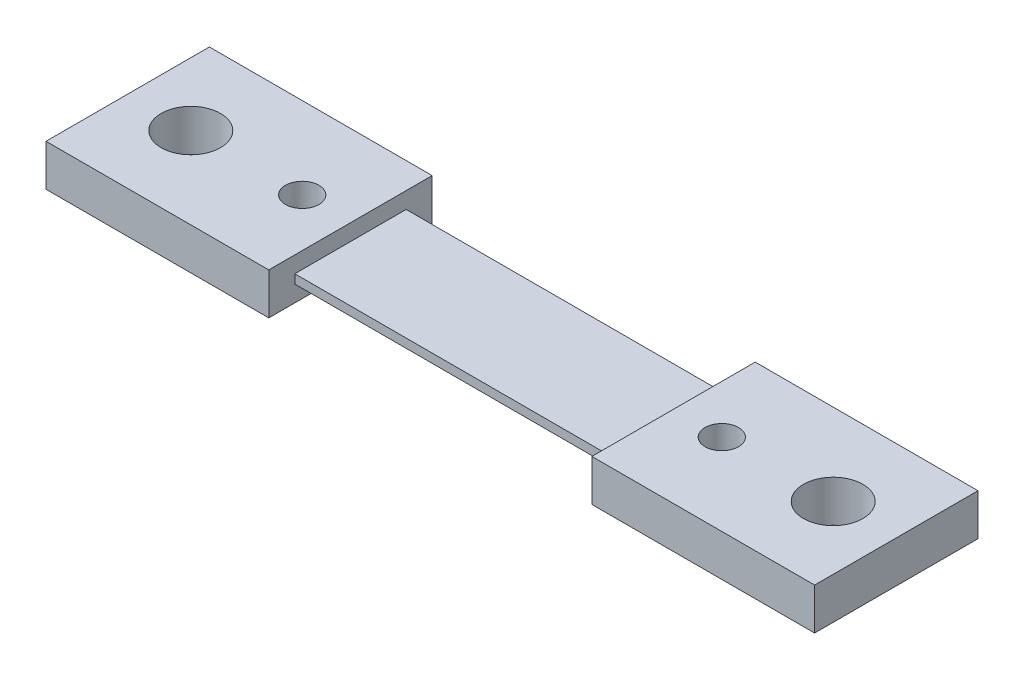
ISO-10303-21;
HEADER;
FILE_DESCRIPTION(('STEP AP214'),'2;1');
FILE_NAME('part.step','',(''),(''),'','','');
FILE_SCHEMA(('AUTOMOTIVE_DESIGN { 1 0 10303 214 1 1 1 1 }'));
ENDSEC;
DATA;
#1=APPLICATION_CONTEXT('core data for automotive mechanical design processes');
#2=APPLICATION_PROTOCOL_DEFINITION('international standard','automotive_design',2000,#1);
#3=PRODUCT_CONTEXT('',#1,'mechanical');
#4=PRODUCT('Part','Part','',(#3));
#5=PRODUCT_RELATED_PRODUCT_CATEGORY('part','',(#4));
#6=PRODUCT_DEFINITION_FORMATION('','',#4);
#7=PRODUCT_DEFINITION_CONTEXT('part definition',#1,'design');
#8=PRODUCT_DEFINITION('design','',#6,#7);
#9=PRODUCT_DEFINITION_SHAPE('','',#8);
#10=(LENGTH_UNIT() NAMED_UNIT(*) SI_UNIT(.MILLI.,.METRE.));
#11=(NAMED_UNIT(*) PLANE_ANGLE_UNIT() SI_UNIT($,.RADIAN.));
#12=(NAMED_UNIT(*) SI_UNIT($,.STERADIAN.) SOLID_ANGLE_UNIT());
#13=UNCERTAINTY_MEASURE_WITH_UNIT(LENGTH_MEASURE(1.E-05),#10,'distance_accuracy_value','');
#14=(GEOMETRIC_REPRESENTATION_CONTEXT(3) GLOBAL_UNCERTAINTY_ASSIGNED_CONTEXT((#13)) GLOBAL_UNIT_ASSIGNED_CONTEXT((#10,
#11,#12)) REPRESENTATION_CONTEXT('',''));
#15=CARTESIAN_POINT('',(0.,0.,0.));
#16=DIRECTION('',(0.,0.,1.));
#17=DIRECTION('',(1.,0.,0.));
#18=AXIS2_PLACEMENT_3D('',#15,#16,#17);
#19=CARTESIAN_POINT('',(-21.75,-0.6,7.5));
#20=DIRECTION('',(0.,0.,1.));
#21=DIRECTION('',(1.,0.,0.));
#22=AXIS2_PLACEMENT_3D('',#19,#20,#21);
#23=PLANE('',#22);
#24=DIRECTION('',(0.,1.,0.));
#25=VECTOR('',#24,1.);
#26=CARTESIAN_POINT('',(21.75,-0.6,7.5));
#27=LINE('',#26,#25);
#28=CARTESIAN_POINT('',(21.75,-0.6,7.5));
#29=VERTEX_POINT('',#28);
#30=CARTESIAN_POINT('',(21.75,0.6,7.5));
#31=VERTEX_POINT('',#30);
#32=EDGE_CURVE('E11',#29,#31,#27,.T.);
#33=ORIENTED_EDGE('',*,*,#32,.T.);
#34=DIRECTION('',(1.,0.,0.));
#35=VECTOR('',#34,1.);
#36=CARTESIAN_POINT('',(-21.75,0.6,7.5));
#37=LINE('',#36,#35);
#38=CARTESIAN_POINT('',(-21.75,0.6,7.5));
#39=VERTEX_POINT('',#38);
#40=EDGE_CURVE('E211',#39,#31,#37,.T.);
#41=ORIENTED_EDGE('',*,*,#40,.F.);
#42=DIRECTION('',(0.,1.,0.));
#43=VECTOR('',#42,1.);
#44=CARTESIAN_POINT('',(-21.75,-0.6,7.5));
#45=LINE('',#44,#43);
#46=CARTESIAN_POINT('',(-21.75,-0.6,7.5));
#47=VERTEX_POINT('',#46);
#48=EDGE_CURVE('E44',#47,#39,#45,.T.);
#49=ORIENTED_EDGE('',*,*,#48,.F.);
#50=DIRECTION('',(1.,0.,0.));
#51=VECTOR('',#50,1.);
#52=CARTESIAN_POINT('',(-21.75,-0.6,7.5));
#53=LINE('',#52,#51);
#54=EDGE_CURVE('E218',#47,#29,#53,.T.);
#55=ORIENTED_EDGE('',*,*,#54,.T.);
#56=EDGE_LOOP('',(#33,#41,#49,#55));
#57=FACE_BOUND('',#56,.T.);
#58=ADVANCED_FACE('F35',(#57),#23,.T.);
#59=CARTESIAN_POINT('',(-21.75,-0.6,-7.5));
#60=DIRECTION('',(0.,0.,-1.));
#61=DIRECTION('',(-1.,0.,0.));
#62=AXIS2_PLACEMENT_3D('',#59,#60,#61);
#63=PLANE('',#62);
#64=DIRECTION('',(0.,1.,0.));
#65=VECTOR('',#64,1.);
#66=CARTESIAN_POINT('',(-21.75,-0.6,-7.5));
#67=LINE('',#66,#65);
#68=CARTESIAN_POINT('',(-21.75,-0.6,-7.5));
#69=VERTEX_POINT('',#68);
#70=CARTESIAN_POINT('',(-21.75,0.6,-7.5));
#71=VERTEX_POINT('',#70);
#72=EDGE_CURVE('E221',#69,#71,#67,.T.);
#73=ORIENTED_EDGE('',*,*,#72,.T.);
#74=DIRECTION('',(-1.,0.,0.));
#75=VECTOR('',#74,1.);
#76=CARTESIAN_POINT('',(-21.75,0.6,-7.5));
#77=LINE('',#76,#75);
#78=CARTESIAN_POINT('',(21.75,0.6,-7.5));
#79=VERTEX_POINT('',#78);
#80=EDGE_CURVE('E206',#79,#71,#77,.T.);
#81=ORIENTED_EDGE('',*,*,#80,.F.);
#82=DIRECTION('',(0.,1.,0.));
#83=VECTOR('',#82,1.);
#84=CARTESIAN_POINT('',(21.75,-0.6,-7.5));
#85=LINE('',#84,#83);
#86=CARTESIAN_POINT('',(21.75,-0.6,-7.5));
#87=VERTEX_POINT('',#86);
#88=EDGE_CURVE('E39',#87,#79,#85,.T.);
#89=ORIENTED_EDGE('',*,*,#88,.F.);
#90=DIRECTION('',(-1.,0.,0.));
#91=VECTOR('',#90,1.);
#92=CARTESIAN_POINT('',(-21.75,-0.6,-7.5));
#93=LINE('',#92,#91);
#94=EDGE_CURVE('E215',#87,#69,#93,.T.);
#95=ORIENTED_EDGE('',*,*,#94,.T.);
#96=EDGE_LOOP('',(#73,#81,#89,#95));
#97=FACE_BOUND('',#96,.T.);
#98=ADVANCED_FACE('F37',(#97),#63,.T.);
#99=CARTESIAN_POINT('',(0.,-0.6,0.));
#100=DIRECTION('',(0.,1.,0.));
#101=DIRECTION('',(0.,0.,1.));
#102=AXIS2_PLACEMENT_3D('',#99,#100,#101);
#103=PLANE('',#102);
#104=DIRECTION('',(0.,0.,-1.));
#105=VECTOR('',#104,1.);
#106=CARTESIAN_POINT('',(21.75,-0.6,-7.5));
#107=LINE('',#106,#105);
#108=EDGE_CURVE('E52',#29,#87,#107,.T.);
#109=ORIENTED_EDGE('',*,*,#108,.F.);
#110=ORIENTED_EDGE('',*,*,#54,.F.);
#111=DIRECTION('',(0.,0.,1.));
#112=VECTOR('',#111,1.);
#113=CARTESIAN_POINT('',(-21.75,-0.6,-7.5));
#114=LINE('',#113,#112);
#115=EDGE_CURVE('E57',#69,#47,#114,.T.);
#116=ORIENTED_EDGE('',*,*,#115,.F.);
#117=ORIENTED_EDGE('',*,*,#94,.F.);
#118=EDGE_LOOP('',(#109,#110,#116,#117));
#119=FACE_BOUND('',#118,.T.);
#120=ADVANCED_FACE('F257',(#119),#103,.F.);
#121=CARTESIAN_POINT('',(0.,0.6,0.));
#122=DIRECTION('',(0.,1.,0.));
#123=DIRECTION('',(0.,0.,1.));
#124=AXIS2_PLACEMENT_3D('',#121,#122,#123);
#125=PLANE('',#124);
#126=DIRECTION('',(0.,0.,-1.));
#127=VECTOR('',#126,1.);
#128=CARTESIAN_POINT('',(21.75,0.6,-7.5));
#129=LINE('',#128,#127);
#130=EDGE_CURVE('E198',#31,#79,#129,.T.);
#131=ORIENTED_EDGE('',*,*,#130,.T.);
#132=ORIENTED_EDGE('',*,*,#80,.T.);
#133=DIRECTION('',(0.,0.,1.));
#134=VECTOR('',#133,1.);
#135=CARTESIAN_POINT('',(-21.75,0.6,-7.5));
#136=LINE('',#135,#134);
#137=EDGE_CURVE('E209',#71,#39,#136,.T.);
#138=ORIENTED_EDGE('',*,*,#137,.T.);
#139=ORIENTED_EDGE('',*,*,#40,.T.);
#140=EDGE_LOOP('',(#131,#132,#138,#139));
#141=FACE_BOUND('',#140,.T.);
#142=ADVANCED_FACE('F233',(#141),#125,.T.);
#143=CARTESIAN_POINT('',(21.75,-2.8,11.));
#144=DIRECTION('',(-1.,0.,0.));
#145=DIRECTION('',(0.,0.,1.));
#146=AXIS2_PLACEMENT_3D('',#143,#144,#145);
#147=PLANE('',#146);
#148=ORIENTED_EDGE('',*,*,#108,.T.);
#149=ORIENTED_EDGE('',*,*,#88,.T.);
#150=ORIENTED_EDGE('',*,*,#130,.F.);
#151=ORIENTED_EDGE('',*,*,#32,.F.);
#152=EDGE_LOOP('',(#148,#149,#150,#151));
#153=FACE_BOUND('',#152,.T.);
#154=DIRECTION('',(0.,1.,0.));
#155=VECTOR('',#154,1.);
#156=CARTESIAN_POINT('',(21.75,-2.8,11.));
#157=LINE('',#156,#155);
#158=CARTESIAN_POINT('',(21.75,-2.8,11.));
#159=VERTEX_POINT('',#158);
#160=CARTESIAN_POINT('',(21.75,2.8,11.));
#161=VERTEX_POINT('',#160);
#162=EDGE_CURVE('E195',#159,#161,#157,.T.);
#163=ORIENTED_EDGE('',*,*,#162,.T.);
#164=DIRECTION('',(0.,0.,1.));
#165=VECTOR('',#164,1.);
#166=CARTESIAN_POINT('',(21.75,2.8,11.));
#167=LINE('',#166,#165);
#168=CARTESIAN_POINT('',(21.75,2.8,-11.));
#169=VERTEX_POINT('',#168);
#170=EDGE_CURVE('E168',#169,#161,#167,.T.);
#171=ORIENTED_EDGE('',*,*,#170,.F.);
#172=DIRECTION('',(0.,1.,0.));
#173=VECTOR('',#172,1.);
#174=CARTESIAN_POINT('',(21.75,-2.8,-11.));
#175=LINE('',#174,#173);
#176=CARTESIAN_POINT('',(21.75,-2.8,-11.));
#177=VERTEX_POINT('',#176);
#178=EDGE_CURVE('E196',#177,#169,#175,.T.);
#179=ORIENTED_EDGE('',*,*,#178,.F.);
#180=DIRECTION('',(0.,0.,1.));
#181=VECTOR('',#180,1.);
#182=CARTESIAN_POINT('',(21.75,-2.8,11.));
#183=LINE('',#182,#181);
#184=EDGE_CURVE('E183',#177,#159,#183,.T.);
#185=ORIENTED_EDGE('',*,*,#184,.T.);
#186=EDGE_LOOP('',(#163,#171,#179,#185));
#187=FACE_BOUND('',#186,.T.);
#188=ADVANCED_FACE('F228',(#153,#187),#147,.T.);
#189=CARTESIAN_POINT('',(51.75,-2.8,-11.));
#190=DIRECTION('',(0.,0.,-1.));
#191=DIRECTION('',(-1.,0.,0.));
#192=AXIS2_PLACEMENT_3D('',#189,#190,#191);
#193=PLANE('',#192);
#194=ORIENTED_EDGE('',*,*,#178,.T.);
#195=DIRECTION('',(-1.,0.,0.));
#196=VECTOR('',#195,1.);
#197=CARTESIAN_POINT('',(51.75,2.8,-11.));
#198=LINE('',#197,#196);
#199=CARTESIAN_POINT('',(51.75,2.8,-11.));
#200=VERTEX_POINT('',#199);
#201=EDGE_CURVE('E180',#200,#169,#198,.T.);
#202=ORIENTED_EDGE('',*,*,#201,.F.);
#203=DIRECTION('',(0.,1.,0.));
#204=VECTOR('',#203,1.);
#205=CARTESIAN_POINT('',(51.75,-2.8,-11.));
#206=LINE('',#205,#204);
#207=CARTESIAN_POINT('',(51.75,-2.8,-11.));
#208=VERTEX_POINT('',#207);
#209=EDGE_CURVE('E199',#208,#200,#206,.T.);
#210=ORIENTED_EDGE('',*,*,#209,.F.);
#211=DIRECTION('',(-1.,0.,0.));
#212=VECTOR('',#211,1.);
#213=CARTESIAN_POINT('',(51.75,-2.8,-11.));
#214=LINE('',#213,#212);
#215=EDGE_CURVE('E192',#208,#177,#214,.T.);
#216=ORIENTED_EDGE('',*,*,#215,.T.);
#217=EDGE_LOOP('',(#194,#202,#210,#216));
#218=FACE_BOUND('',#217,.T.);
#219=ADVANCED_FACE('F265',(#218),#193,.T.);
#220=CARTESIAN_POINT('',(51.75,-2.8,11.));
#221=DIRECTION('',(1.,0.,0.));
#222=DIRECTION('',(0.,0.,-1.));
#223=AXIS2_PLACEMENT_3D('',#220,#221,#222);
#224=PLANE('',#223);
#225=ORIENTED_EDGE('',*,*,#209,.T.);
#226=DIRECTION('',(0.,0.,-1.));
#227=VECTOR('',#226,1.);
#228=CARTESIAN_POINT('',(51.75,2.8,11.));
#229=LINE('',#228,#227);
#230=CARTESIAN_POINT('',(51.75,2.8,11.));
#231=VERTEX_POINT('',#230);
#232=EDGE_CURVE('E177',#231,#200,#229,.T.);
#233=ORIENTED_EDGE('',*,*,#232,.F.);
#234=DIRECTION('',(0.,1.,0.));
#235=VECTOR('',#234,1.);
#236=CARTESIAN_POINT('',(51.75,-2.8,11.));
#237=LINE('',#236,#235);
#238=CARTESIAN_POINT('',(51.75,-2.8,11.));
#239=VERTEX_POINT('',#238);
#240=EDGE_CURVE('E201',#239,#231,#237,.T.);
#241=ORIENTED_EDGE('',*,*,#240,.F.);
#242=DIRECTION('',(0.,0.,-1.));
#243=VECTOR('',#242,1.);
#244=CARTESIAN_POINT('',(51.75,-2.8,11.));
#245=LINE('',#244,#243);
#246=EDGE_CURVE('E189',#239,#208,#245,.T.);
#247=ORIENTED_EDGE('',*,*,#246,.T.);
#248=EDGE_LOOP('',(#225,#233,#241,#247));
#249=FACE_BOUND('',#248,.T.);
#250=ADVANCED_FACE('F269',(#249),#224,.T.);
#251=CARTESIAN_POINT('',(51.75,-2.8,11.));
#252=DIRECTION('',(0.,0.,1.));
#253=DIRECTION('',(1.,0.,0.));
#254=AXIS2_PLACEMENT_3D('',#251,#252,#253);
#255=PLANE('',#254);
#256=ORIENTED_EDGE('',*,*,#240,.T.);
#257=DIRECTION('',(1.,0.,0.));
#258=VECTOR('',#257,1.);
#259=CARTESIAN_POINT('',(51.75,2.8,11.));
#260=LINE('',#259,#258);
#261=EDGE_CURVE('E174',#161,#231,#260,.T.);
#262=ORIENTED_EDGE('',*,*,#261,.F.);
#263=ORIENTED_EDGE('',*,*,#162,.F.);
#264=DIRECTION('',(1.,0.,0.));
#265=VECTOR('',#264,1.);
#266=CARTESIAN_POINT('',(51.75,-2.8,11.));
#267=LINE('',#266,#265);
#268=EDGE_CURVE('E186',#159,#239,#267,.T.);
#269=ORIENTED_EDGE('',*,*,#268,.T.);
#270=EDGE_LOOP('',(#256,#262,#263,#269));
#271=FACE_BOUND('',#270,.T.);
#272=ADVANCED_FACE('F266',(#271),#255,.T.);
#273=CARTESIAN_POINT('',(0.,-2.8,0.));
#274=DIRECTION('',(0.,1.,0.));
#275=DIRECTION('',(0.,0.,1.));
#276=AXIS2_PLACEMENT_3D('',#273,#274,#275);
#277=PLANE('',#276);
#278=CARTESIAN_POINT('',(43.25,-2.8,0.));
#279=DIRECTION('',(0.,1.,0.));
#280=DIRECTION('',(0.,0.,1.));
#281=AXIS2_PLACEMENT_3D('',#278,#279,#280);
#282=CIRCLE('',#281,4.00000000000001);
#283=CARTESIAN_POINT('',(43.25,-2.8,4.00000000000001));
#284=VERTEX_POINT('',#283);
#285=EDGE_CURVE('E284',#284,#284,#282,.T.);
#286=ORIENTED_EDGE('',*,*,#285,.T.);
#287=EDGE_LOOP('',(#286));
#288=FACE_BOUND('',#287,.T.);
#289=CARTESIAN_POINT('',(28.25,-2.8,0.));
#290=DIRECTION('',(0.,1.,0.));
#291=DIRECTION('',(0.,0.,1.));
#292=AXIS2_PLACEMENT_3D('',#289,#290,#291);
#293=CIRCLE('',#292,2.25);
#294=CARTESIAN_POINT('',(28.25,-2.8,2.25));
#295=VERTEX_POINT('',#294);
#296=EDGE_CURVE('E149',#295,#295,#293,.T.);
#297=ORIENTED_EDGE('',*,*,#296,.T.);
#298=EDGE_LOOP('',(#297));
#299=FACE_BOUND('',#298,.T.);
#300=ORIENTED_EDGE('',*,*,#184,.F.);
#301=ORIENTED_EDGE('',*,*,#215,.F.);
#302=ORIENTED_EDGE('',*,*,#246,.F.);
#303=ORIENTED_EDGE('',*,*,#268,.F.);
#304=EDGE_LOOP('',(#300,#301,#302,#303));
#305=FACE_BOUND('',#304,.T.);
#306=ADVANCED_FACE('F249',(#288,#299,#305),#277,.F.);
#307=CARTESIAN_POINT('',(0.,2.8,0.));
#308=DIRECTION('',(0.,1.,0.));
#309=DIRECTION('',(0.,0.,1.));
#310=AXIS2_PLACEMENT_3D('',#307,#308,#309);
#311=PLANE('',#310);
#312=CARTESIAN_POINT('',(43.25,2.8,0.));
#313=DIRECTION('',(0.,1.,0.));
#314=DIRECTION('',(0.,0.,1.));
#315=AXIS2_PLACEMENT_3D('',#312,#313,#314);
#316=CIRCLE('',#315,4.00000000000001);
#317=CARTESIAN_POINT('',(43.25,2.8,4.00000000000001));
#318=VERTEX_POINT('',#317);
#319=EDGE_CURVE('E306',#318,#318,#316,.T.);
#320=ORIENTED_EDGE('',*,*,#319,.F.);
#321=EDGE_LOOP('',(#320));
#322=FACE_BOUND('',#321,.T.);
#323=CARTESIAN_POINT('',(28.25,2.8,0.));
#324=DIRECTION('',(0.,1.,0.));
#325=DIRECTION('',(0.,0.,1.));
#326=AXIS2_PLACEMENT_3D('',#323,#324,#325);
#327=CIRCLE('',#326,2.25);
#328=CARTESIAN_POINT('',(28.25,2.8,2.25));
#329=VERTEX_POINT('',#328);
#330=EDGE_CURVE('E152',#329,#329,#327,.T.);
#331=ORIENTED_EDGE('',*,*,#330,.F.);
#332=EDGE_LOOP('',(#331));
#333=FACE_BOUND('',#332,.T.);
#334=ORIENTED_EDGE('',*,*,#170,.T.);
#335=ORIENTED_EDGE('',*,*,#261,.T.);
#336=ORIENTED_EDGE('',*,*,#232,.T.);
#337=ORIENTED_EDGE('',*,*,#201,.T.);
#338=EDGE_LOOP('',(#334,#335,#336,#337));
#339=FACE_BOUND('',#338,.T.);
#340=ADVANCED_FACE('F240',(#322,#333,#339),#311,.T.);
#341=CARTESIAN_POINT('',(-21.75,-2.8,-11.));
#342=DIRECTION('',(1.,0.,0.));
#343=DIRECTION('',(0.,0.,-1.));
#344=AXIS2_PLACEMENT_3D('',#341,#342,#343);
#345=PLANE('',#344);
#346=ORIENTED_EDGE('',*,*,#115,.T.);
#347=ORIENTED_EDGE('',*,*,#48,.T.);
#348=ORIENTED_EDGE('',*,*,#137,.F.);
#349=ORIENTED_EDGE('',*,*,#72,.F.);
#350=EDGE_LOOP('',(#346,#347,#348,#349));
#351=FACE_BOUND('',#350,.T.);
#352=DIRECTION('',(0.,1.,0.));
#353=VECTOR('',#352,1.);
#354=CARTESIAN_POINT('',(-21.75,-2.8,-11.));
#355=LINE('',#354,#353);
#356=CARTESIAN_POINT('',(-21.75,-2.8,-11.));
#357=VERTEX_POINT('',#356);
#358=CARTESIAN_POINT('',(-21.75,2.8,-11.));
#359=VERTEX_POINT('',#358);
#360=EDGE_CURVE('E124',#357,#359,#355,.T.);
#361=ORIENTED_EDGE('',*,*,#360,.T.);
#362=DIRECTION('',(0.,0.,-1.));
#363=VECTOR('',#362,1.);
#364=CARTESIAN_POINT('',(-21.75,2.8,-11.));
#365=LINE('',#364,#363);
#366=CARTESIAN_POINT('',(-21.75,2.8,11.));
#367=VERTEX_POINT('',#366);
#368=EDGE_CURVE('E128',#367,#359,#365,.T.);
#369=ORIENTED_EDGE('',*,*,#368,.F.);
#370=DIRECTION('',(0.,1.,0.));
#371=VECTOR('',#370,1.);
#372=CARTESIAN_POINT('',(-21.75,-2.8,11.));
#373=LINE('',#372,#371);
#374=CARTESIAN_POINT('',(-21.75,-2.8,11.));
#375=VERTEX_POINT('',#374);
#376=EDGE_CURVE('E166',#375,#367,#373,.T.);
#377=ORIENTED_EDGE('',*,*,#376,.F.);
#378=DIRECTION('',(0.,0.,-1.));
#379=VECTOR('',#378,1.);
#380=CARTESIAN_POINT('',(-21.75,-2.8,-11.));
#381=LINE('',#380,#379);
#382=EDGE_CURVE('E130',#375,#357,#381,.T.);
#383=ORIENTED_EDGE('',*,*,#382,.T.);
#384=EDGE_LOOP('',(#361,#369,#377,#383));
#385=FACE_BOUND('',#384,.T.);
#386=ADVANCED_FACE('F126',(#351,#385),#345,.T.);
#387=CARTESIAN_POINT('',(-51.75,-2.8,11.));
#388=DIRECTION('',(0.,0.,1.));
#389=DIRECTION('',(1.,0.,0.));
#390=AXIS2_PLACEMENT_3D('',#387,#388,#389);
#391=PLANE('',#390);
#392=ORIENTED_EDGE('',*,*,#376,.T.);
#393=DIRECTION('',(1.,0.,0.));
#394=VECTOR('',#393,1.);
#395=CARTESIAN_POINT('',(-51.75,2.8,11.));
#396=LINE('',#395,#394);
#397=CARTESIAN_POINT('',(-51.75,2.8,11.));
#398=VERTEX_POINT('',#397);
#399=EDGE_CURVE('E148',#398,#367,#396,.T.);
#400=ORIENTED_EDGE('',*,*,#399,.F.);
#401=DIRECTION('',(0.,1.,0.));
#402=VECTOR('',#401,1.);
#403=CARTESIAN_POINT('',(-51.75,-2.8,11.));
#404=LINE('',#403,#402);
#405=CARTESIAN_POINT('',(-51.75,-2.8,11.));
#406=VERTEX_POINT('',#405);
#407=EDGE_CURVE('E169',#406,#398,#404,.T.);
#408=ORIENTED_EDGE('',*,*,#407,.F.);
#409=DIRECTION('',(1.,0.,0.));
#410=VECTOR('',#409,1.);
#411=CARTESIAN_POINT('',(-51.75,-2.8,11.));
#412=LINE('',#411,#410);
#413=EDGE_CURVE('E135',#406,#375,#412,.T.);
#414=ORIENTED_EDGE('',*,*,#413,.T.);
#415=EDGE_LOOP('',(#392,#400,#408,#414));
#416=FACE_BOUND('',#415,.T.);
#417=ADVANCED_FACE('F239',(#416),#391,.T.);
#418=CARTESIAN_POINT('',(-51.75,-2.8,-11.));
#419=DIRECTION('',(-1.,0.,0.));
#420=DIRECTION('',(0.,0.,1.));
#421=AXIS2_PLACEMENT_3D('',#418,#419,#420);
#422=PLANE('',#421);
#423=ORIENTED_EDGE('',*,*,#407,.T.);
#424=DIRECTION('',(0.,0.,1.));
#425=VECTOR('',#424,1.);
#426=CARTESIAN_POINT('',(-51.75,2.8,-11.));
#427=LINE('',#426,#425);
#428=CARTESIAN_POINT('',(-51.75,2.8,-11.));
#429=VERTEX_POINT('',#428);
#430=EDGE_CURVE('E143',#429,#398,#427,.T.);
#431=ORIENTED_EDGE('',*,*,#430,.F.);
#432=DIRECTION('',(0.,1.,0.));
#433=VECTOR('',#432,1.);
#434=CARTESIAN_POINT('',(-51.75,-2.8,-11.));
#435=LINE('',#434,#433);
#436=CARTESIAN_POINT('',(-51.75,-2.8,-11.));
#437=VERTEX_POINT('',#436);
#438=EDGE_CURVE('E134',#437,#429,#435,.T.);
#439=ORIENTED_EDGE('',*,*,#438,.F.);
#440=DIRECTION('',(0.,0.,1.));
#441=VECTOR('',#440,1.);
#442=CARTESIAN_POINT('',(-51.75,-2.8,-11.));
#443=LINE('',#442,#441);
#444=EDGE_CURVE('E161',#437,#406,#443,.T.);
#445=ORIENTED_EDGE('',*,*,#444,.T.);
#446=EDGE_LOOP('',(#423,#431,#439,#445));
#447=FACE_BOUND('',#446,.T.);
#448=ADVANCED_FACE('F246',(#447),#422,.T.);
#449=CARTESIAN_POINT('',(-51.75,-2.8,-11.));
#450=DIRECTION('',(0.,0.,-1.));
#451=DIRECTION('',(-1.,0.,0.));
#452=AXIS2_PLACEMENT_3D('',#449,#450,#451);
#453=PLANE('',#452);
#454=ORIENTED_EDGE('',*,*,#438,.T.);
#455=DIRECTION('',(-1.,0.,0.));
#456=VECTOR('',#455,1.);
#457=CARTESIAN_POINT('',(-51.75,2.8,-11.));
#458=LINE('',#457,#456);
#459=EDGE_CURVE('E138',#359,#429,#458,.T.);
#460=ORIENTED_EDGE('',*,*,#459,.F.);
#461=ORIENTED_EDGE('',*,*,#360,.F.);
#462=DIRECTION('',(-1.,0.,0.));
#463=VECTOR('',#462,1.);
#464=CARTESIAN_POINT('',(-51.75,-2.8,-11.));
#465=LINE('',#464,#463);
#466=EDGE_CURVE('E159',#357,#437,#465,.T.);
#467=ORIENTED_EDGE('',*,*,#466,.T.);
#468=EDGE_LOOP('',(#454,#460,#461,#467));
#469=FACE_BOUND('',#468,.T.);
#470=ADVANCED_FACE('F139',(#469),#453,.T.);
#471=CARTESIAN_POINT('',(0.,-2.8,0.));
#472=DIRECTION('',(0.,1.,0.));
#473=DIRECTION('',(0.,0.,1.));
#474=AXIS2_PLACEMENT_3D('',#471,#472,#473);
#475=PLANE('',#474);
#476=CARTESIAN_POINT('',(-43.25,-2.8,0.));
#477=DIRECTION('',(0.,1.,0.));
#478=DIRECTION('',(0.,0.,-1.));
#479=AXIS2_PLACEMENT_3D('',#476,#477,#478);
#480=CIRCLE('',#479,4.00000000000001);
#481=CARTESIAN_POINT('',(-43.25,-2.8,-4.));
#482=VERTEX_POINT('',#481);
#483=EDGE_CURVE('E309',#482,#482,#480,.T.);
#484=ORIENTED_EDGE('',*,*,#483,.T.);
#485=EDGE_LOOP('',(#484));
#486=FACE_BOUND('',#485,.T.);
#487=CARTESIAN_POINT('',(-28.25,-2.8,0.));
#488=DIRECTION('',(0.,1.,0.));
#489=DIRECTION('',(0.,0.,-1.));
#490=AXIS2_PLACEMENT_3D('',#487,#488,#489);
#491=CIRCLE('',#490,2.25);
#492=CARTESIAN_POINT('',(-28.25,-2.8,-2.24999999999999));
#493=VERTEX_POINT('',#492);
#494=EDGE_CURVE('E314',#493,#493,#491,.T.);
#495=ORIENTED_EDGE('',*,*,#494,.T.);
#496=EDGE_LOOP('',(#495));
#497=FACE_BOUND('',#496,.T.);
#498=ORIENTED_EDGE('',*,*,#382,.F.);
#499=ORIENTED_EDGE('',*,*,#413,.F.);
#500=ORIENTED_EDGE('',*,*,#444,.F.);
#501=ORIENTED_EDGE('',*,*,#466,.F.);
#502=EDGE_LOOP('',(#498,#499,#500,#501));
#503=FACE_BOUND('',#502,.T.);
#504=ADVANCED_FACE('F327',(#486,#497,#503),#475,.F.);
#505=CARTESIAN_POINT('',(0.,2.8,0.));
#506=DIRECTION('',(0.,1.,0.));
#507=DIRECTION('',(0.,0.,1.));
#508=AXIS2_PLACEMENT_3D('',#505,#506,#507);
#509=PLANE('',#508);
#510=CARTESIAN_POINT('',(-43.25,2.8,0.));
#511=DIRECTION('',(0.,1.,0.));
#512=DIRECTION('',(0.,0.,-1.));
#513=AXIS2_PLACEMENT_3D('',#510,#511,#512);
#514=CIRCLE('',#513,4.00000000000001);
#515=CARTESIAN_POINT('',(-43.25,2.8,-4.));
#516=VERTEX_POINT('',#515);
#517=EDGE_CURVE('E312',#516,#516,#514,.T.);
#518=ORIENTED_EDGE('',*,*,#517,.F.);
#519=EDGE_LOOP('',(#518));
#520=FACE_BOUND('',#519,.T.);
#521=CARTESIAN_POINT('',(-28.25,2.8,0.));
#522=DIRECTION('',(0.,1.,0.));
#523=DIRECTION('',(0.,0.,-1.));
#524=AXIS2_PLACEMENT_3D('',#521,#522,#523);
#525=CIRCLE('',#524,2.25);
#526=CARTESIAN_POINT('',(-28.25,2.8,-2.24999999999999));
#527=VERTEX_POINT('',#526);
#528=EDGE_CURVE('E320',#527,#527,#525,.T.);
#529=ORIENTED_EDGE('',*,*,#528,.F.);
#530=EDGE_LOOP('',(#529));
#531=FACE_BOUND('',#530,.T.);
#532=ORIENTED_EDGE('',*,*,#368,.T.);
#533=ORIENTED_EDGE('',*,*,#459,.T.);
#534=ORIENTED_EDGE('',*,*,#430,.T.);
#535=ORIENTED_EDGE('',*,*,#399,.T.);
#536=EDGE_LOOP('',(#532,#533,#534,#535));
#537=FACE_BOUND('',#536,.T.);
#538=ADVANCED_FACE('F146',(#520,#531,#537),#509,.T.);
#539=CARTESIAN_POINT('',(-28.25,-2.8,0.));
#540=DIRECTION('',(0.,1.,0.));
#541=DIRECTION('',(0.,0.,1.));
#542=AXIS2_PLACEMENT_3D('',#539,#540,#541);
#543=CYLINDRICAL_SURFACE('',#542,2.25);
#544=ORIENTED_EDGE('',*,*,#494,.F.);
#545=EDGE_LOOP('',(#544));
#546=FACE_BOUND('',#545,.T.);
#547=ORIENTED_EDGE('',*,*,#528,.T.);
#548=EDGE_LOOP('',(#547));
#549=FACE_BOUND('',#548,.T.);
#550=ADVANCED_FACE('F324',(#546,#549),#543,.F.);
#551=CARTESIAN_POINT('',(-43.25,-2.8,0.));
#552=DIRECTION('',(0.,1.,0.));
#553=DIRECTION('',(0.,0.,1.));
#554=AXIS2_PLACEMENT_3D('',#551,#552,#553);
#555=CYLINDRICAL_SURFACE('',#554,4.00000000000001);
#556=ORIENTED_EDGE('',*,*,#483,.F.);
#557=EDGE_LOOP('',(#556));
#558=FACE_BOUND('',#557,.T.);
#559=ORIENTED_EDGE('',*,*,#517,.T.);
#560=EDGE_LOOP('',(#559));
#561=FACE_BOUND('',#560,.T.);
#562=ADVANCED_FACE('F301',(#558,#561),#555,.F.);
#563=CARTESIAN_POINT('',(28.25,-2.8,0.));
#564=DIRECTION('',(0.,1.,0.));
#565=DIRECTION('',(0.,0.,1.));
#566=AXIS2_PLACEMENT_3D('',#563,#564,#565);
#567=CYLINDRICAL_SURFACE('',#566,2.25);
#568=ORIENTED_EDGE('',*,*,#296,.F.);
#569=EDGE_LOOP('',(#568));
#570=FACE_BOUND('',#569,.T.);
#571=ORIENTED_EDGE('',*,*,#330,.T.);
#572=EDGE_LOOP('',(#571));
#573=FACE_BOUND('',#572,.T.);
#574=ADVANCED_FACE('F297',(#570,#573),#567,.F.);
#575=CARTESIAN_POINT('',(43.25,-2.8,0.));
#576=DIRECTION('',(0.,1.,0.));
#577=DIRECTION('',(0.,0.,1.));
#578=AXIS2_PLACEMENT_3D('',#575,#576,#577);
#579=CYLINDRICAL_SURFACE('',#578,4.00000000000001);
#580=ORIENTED_EDGE('',*,*,#285,.F.);
#581=EDGE_LOOP('',(#580));
#582=FACE_BOUND('',#581,.T.);
#583=ORIENTED_EDGE('',*,*,#319,.T.);
#584=EDGE_LOOP('',(#583));
#585=FACE_BOUND('',#584,.T.);
#586=ADVANCED_FACE('F300',(#582,#585),#579,.F.);
#587=CLOSED_SHELL('',(#58,#98,#120,#142,#188,#219,#250,#272,#306,#340,#386,#417,#448,#470,#504,
#538,#550,#562,#574,#586));
#588=MANIFOLD_SOLID_BREP('B2',#587);
#589=ADVANCED_BREP_SHAPE_REPRESENTATION('',(#18,#588),#14);
#590=SHAPE_DEFINITION_REPRESENTATION(#9,#589);
ENDSEC;
END-ISO-10303-21;
